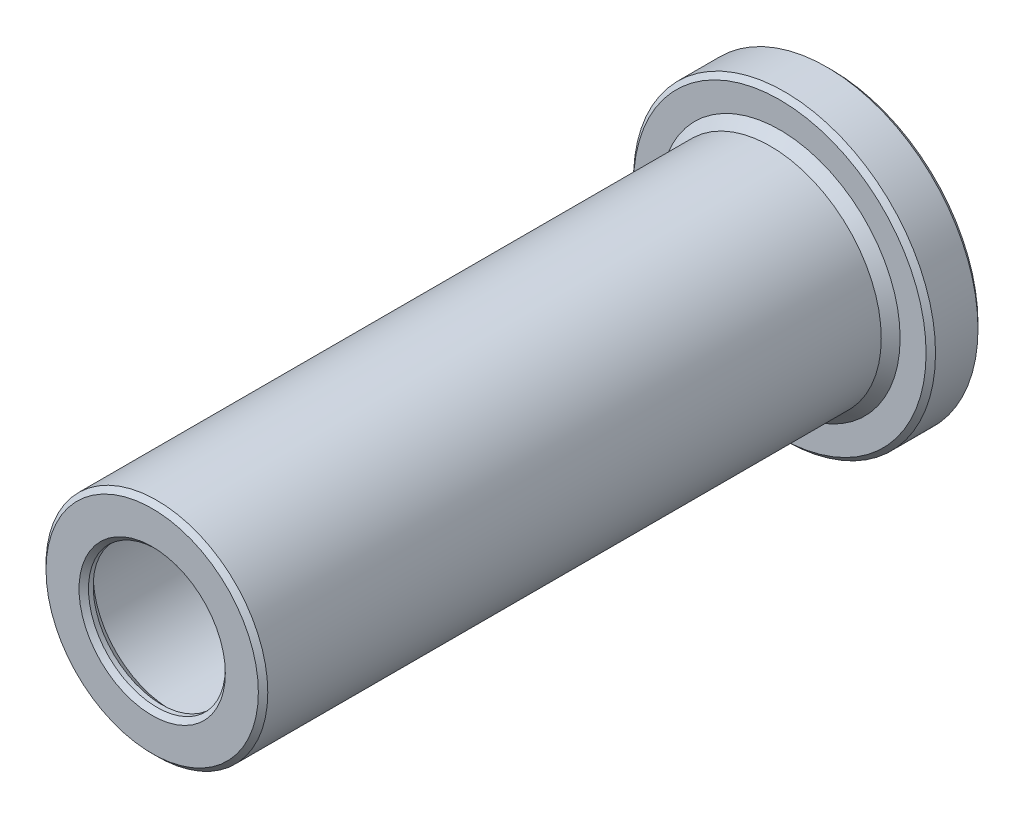
ISO-10303-21;
HEADER;
FILE_DESCRIPTION(('STEP AP214'),'2;1');
FILE_NAME('part.step','',(''),(''),'','','');
FILE_SCHEMA(('AUTOMOTIVE_DESIGN { 1 0 10303 214 1 1 1 1 }'));
ENDSEC;
DATA;
#1=APPLICATION_CONTEXT('core data for automotive mechanical design processes');
#2=APPLICATION_PROTOCOL_DEFINITION('international standard','automotive_design',2000,#1);
#3=PRODUCT_CONTEXT('',#1,'mechanical');
#4=PRODUCT('Part','Part','',(#3));
#5=PRODUCT_RELATED_PRODUCT_CATEGORY('part','',(#4));
#6=PRODUCT_DEFINITION_FORMATION('','',#4);
#7=PRODUCT_DEFINITION_CONTEXT('part definition',#1,'design');
#8=PRODUCT_DEFINITION('design','',#6,#7);
#9=PRODUCT_DEFINITION_SHAPE('','',#8);
#10=(LENGTH_UNIT() NAMED_UNIT(*) SI_UNIT(.MILLI.,.METRE.));
#11=(NAMED_UNIT(*) PLANE_ANGLE_UNIT() SI_UNIT($,.RADIAN.));
#12=(NAMED_UNIT(*) SI_UNIT($,.STERADIAN.) SOLID_ANGLE_UNIT());
#13=UNCERTAINTY_MEASURE_WITH_UNIT(LENGTH_MEASURE(1.E-05),#10,'distance_accuracy_value','');
#14=(GEOMETRIC_REPRESENTATION_CONTEXT(3) GLOBAL_UNCERTAINTY_ASSIGNED_CONTEXT((#13)) GLOBAL_UNIT_ASSIGNED_CONTEXT((#10,
#11,#12)) REPRESENTATION_CONTEXT('',''));
#15=CARTESIAN_POINT('',(0.,0.,0.));
#16=DIRECTION('',(0.,0.,1.));
#17=DIRECTION('',(1.,0.,0.));
#18=AXIS2_PLACEMENT_3D('',#15,#16,#17);
#19=CARTESIAN_POINT('',(0.,0.,0.));
#20=DIRECTION('',(0.,0.,1.));
#21=DIRECTION('',(1.,0.,0.));
#22=AXIS2_PLACEMENT_3D('',#19,#20,#21);
#23=PLANE('',#22);
#24=CARTESIAN_POINT('',(0.,0.,0.));
#25=DIRECTION('',(0.,0.,1.));
#26=DIRECTION('',(1.,0.,0.));
#27=AXIS2_PLACEMENT_3D('',#24,#25,#26);
#28=CIRCLE('',#27,12.75);
#29=CARTESIAN_POINT('',(-12.75,0.,0.));
#30=VERTEX_POINT('',#29);
#31=EDGE_CURVE('E136',#30,#30,#28,.T.);
#32=ORIENTED_EDGE('',*,*,#31,.T.);
#33=EDGE_LOOP('',(#32));
#34=FACE_BOUND('',#33,.T.);
#35=CARTESIAN_POINT('',(0.,0.,0.));
#36=DIRECTION('',(0.,0.,1.));
#37=DIRECTION('',(1.,0.,0.));
#38=AXIS2_PLACEMENT_3D('',#35,#36,#37);
#39=CIRCLE('',#38,15.5);
#40=CARTESIAN_POINT('',(15.5,0.,0.));
#41=VERTEX_POINT('',#40);
#42=EDGE_CURVE('E140',#41,#41,#39,.F.);
#43=ORIENTED_EDGE('',*,*,#42,.T.);
#44=EDGE_LOOP('',(#43));
#45=FACE_BOUND('',#44,.T.);
#46=ADVANCED_FACE('F79',(#34,#45),#23,.F.);
#47=CARTESIAN_POINT('',(0.,0.,70.));
#48=DIRECTION('',(0.,0.,-1.));
#49=DIRECTION('',(-1.,0.,0.));
#50=AXIS2_PLACEMENT_3D('',#47,#48,#49);
#51=CYLINDRICAL_SURFACE('',#50,11.75);
#52=CARTESIAN_POINT('',(0.,0.,71.5));
#53=DIRECTION('',(0.,0.,1.));
#54=DIRECTION('',(1.,0.,0.));
#55=AXIS2_PLACEMENT_3D('',#52,#53,#54);
#56=CIRCLE('',#55,11.75);
#57=CARTESIAN_POINT('',(11.75,0.,71.5));
#58=VERTEX_POINT('',#57);
#59=EDGE_CURVE('E116',#58,#58,#56,.F.);
#60=ORIENTED_EDGE('',*,*,#59,.T.);
#61=EDGE_LOOP('',(#60));
#62=FACE_BOUND('',#61,.T.);
#63=CARTESIAN_POINT('',(0.,0.,6.50000000000001));
#64=DIRECTION('',(0.,0.,1.));
#65=DIRECTION('',(1.,0.,0.));
#66=AXIS2_PLACEMENT_3D('',#63,#64,#65);
#67=CIRCLE('',#66,11.75);
#68=CARTESIAN_POINT('',(11.75,0.,6.50000000000001));
#69=VERTEX_POINT('',#68);
#70=EDGE_CURVE('E120',#69,#69,#67,.T.);
#71=ORIENTED_EDGE('',*,*,#70,.T.);
#72=EDGE_LOOP('',(#71));
#73=FACE_BOUND('',#72,.T.);
#74=ADVANCED_FACE('F168',(#62,#73),#51,.T.);
#75=CARTESIAN_POINT('',(0.,0.,70.));
#76=DIRECTION('',(0.,0.,-1.));
#77=DIRECTION('',(-1.,0.,0.));
#78=AXIS2_PLACEMENT_3D('',#75,#76,#77);
#79=CYLINDRICAL_SURFACE('',#78,9.25);
#80=CARTESIAN_POINT('',(0.,0.,3.5));
#81=DIRECTION('',(0.,0.,1.));
#82=DIRECTION('',(1.,0.,0.));
#83=AXIS2_PLACEMENT_3D('',#80,#81,#82);
#84=CIRCLE('',#83,9.25);
#85=CARTESIAN_POINT('',(-9.25,0.,3.5));
#86=VERTEX_POINT('',#85);
#87=EDGE_CURVE('E132',#86,#86,#84,.F.);
#88=ORIENTED_EDGE('',*,*,#87,.T.);
#89=EDGE_LOOP('',(#88));
#90=FACE_BOUND('',#89,.T.);
#91=CARTESIAN_POINT('',(0.,0.,70.));
#92=DIRECTION('',(0.,0.,1.));
#93=DIRECTION('',(1.,0.,0.));
#94=AXIS2_PLACEMENT_3D('',#91,#92,#93);
#95=CIRCLE('',#94,9.25);
#96=CARTESIAN_POINT('',(9.25,0.,70.));
#97=VERTEX_POINT('',#96);
#98=EDGE_CURVE('E144',#97,#97,#95,.T.);
#99=ORIENTED_EDGE('',*,*,#98,.T.);
#100=EDGE_LOOP('',(#99));
#101=FACE_BOUND('',#100,.T.);
#102=ADVANCED_FACE('F149',(#90,#101),#79,.F.);
#103=CARTESIAN_POINT('',(0.,0.,5.5));
#104=DIRECTION('',(0.,0.,1.));
#105=DIRECTION('',(1.,0.,0.));
#106=AXIS2_PLACEMENT_3D('',#103,#104,#105);
#107=PLANE('',#106);
#108=CARTESIAN_POINT('',(0.,0.,5.5));
#109=DIRECTION('',(0.,0.,1.));
#110=DIRECTION('',(1.,0.,0.));
#111=AXIS2_PLACEMENT_3D('',#108,#109,#110);
#112=CIRCLE('',#111,15.5);
#113=CARTESIAN_POINT('',(15.5,0.,5.5));
#114=VERTEX_POINT('',#113);
#115=EDGE_CURVE('E88',#114,#114,#112,.T.);
#116=ORIENTED_EDGE('',*,*,#115,.T.);
#117=EDGE_LOOP('',(#116));
#118=FACE_BOUND('',#117,.T.);
#119=CARTESIAN_POINT('',(0.,0.,5.5));
#120=DIRECTION('',(0.,0.,1.));
#121=DIRECTION('',(1.,0.,0.));
#122=AXIS2_PLACEMENT_3D('',#119,#120,#121);
#123=CIRCLE('',#122,12.75);
#124=CARTESIAN_POINT('',(12.75,0.,5.5));
#125=VERTEX_POINT('',#124);
#126=EDGE_CURVE('E93',#125,#125,#123,.F.);
#127=ORIENTED_EDGE('',*,*,#126,.T.);
#128=EDGE_LOOP('',(#127));
#129=FACE_BOUND('',#128,.T.);
#130=ADVANCED_FACE('F163',(#118,#129),#107,.T.);
#131=CARTESIAN_POINT('',(0.,0.,5.5));
#132=DIRECTION('',(0.,0.,-1.));
#133=DIRECTION('',(-1.,0.,0.));
#134=AXIS2_PLACEMENT_3D('',#131,#132,#133);
#135=CYLINDRICAL_SURFACE('',#134,16.);
#136=CARTESIAN_POINT('',(0.,0.,0.5));
#137=DIRECTION('',(0.,0.,1.));
#138=DIRECTION('',(1.,0.,0.));
#139=AXIS2_PLACEMENT_3D('',#136,#137,#138);
#140=CIRCLE('',#139,16.);
#141=CARTESIAN_POINT('',(16.,0.,0.5));
#142=VERTEX_POINT('',#141);
#143=EDGE_CURVE('E98',#142,#142,#140,.T.);
#144=ORIENTED_EDGE('',*,*,#143,.T.);
#145=EDGE_LOOP('',(#144));
#146=FACE_BOUND('',#145,.T.);
#147=CARTESIAN_POINT('',(0.,0.,5.));
#148=DIRECTION('',(0.,0.,1.));
#149=DIRECTION('',(1.,0.,0.));
#150=AXIS2_PLACEMENT_3D('',#147,#148,#149);
#151=CIRCLE('',#150,16.);
#152=CARTESIAN_POINT('',(16.,0.,5.));
#153=VERTEX_POINT('',#152);
#154=EDGE_CURVE('E104',#153,#153,#151,.F.);
#155=ORIENTED_EDGE('',*,*,#154,.T.);
#156=EDGE_LOOP('',(#155));
#157=FACE_BOUND('',#156,.T.);
#158=ADVANCED_FACE('F154',(#146,#157),#135,.T.);
#159=CARTESIAN_POINT('',(0.,0.,70.));
#160=DIRECTION('',(0.,0.,1.));
#161=DIRECTION('',(1.,0.,0.));
#162=AXIS2_PLACEMENT_3D('',#159,#160,#161);
#163=PLANE('',#162);
#164=CARTESIAN_POINT('',(0.,0.,70.));
#165=DIRECTION('',(0.,0.,1.));
#166=DIRECTION('',(1.,0.,0.));
#167=AXIS2_PLACEMENT_3D('',#164,#165,#166);
#168=CIRCLE('',#167,8.25);
#169=CARTESIAN_POINT('',(8.25,0.,70.));
#170=VERTEX_POINT('',#169);
#171=EDGE_CURVE('E12',#170,#170,#168,.T.);
#172=ORIENTED_EDGE('',*,*,#171,.T.);
#173=EDGE_LOOP('',(#172));
#174=FACE_BOUND('',#173,.T.);
#175=ORIENTED_EDGE('',*,*,#98,.F.);
#176=EDGE_LOOP('',(#175));
#177=FACE_BOUND('',#176,.T.);
#178=ADVANCED_FACE('F151',(#174,#177),#163,.F.);
#179=CARTESIAN_POINT('',(0.,0.,72.));
#180=DIRECTION('',(0.,0.,1.));
#181=DIRECTION('',(1.,0.,0.));
#182=AXIS2_PLACEMENT_3D('',#179,#180,#181);
#183=PLANE('',#182);
#184=CARTESIAN_POINT('',(0.,0.,72.));
#185=DIRECTION('',(0.,0.,1.));
#186=DIRECTION('',(1.,0.,0.));
#187=AXIS2_PLACEMENT_3D('',#184,#185,#186);
#188=CIRCLE('',#187,11.25);
#189=CARTESIAN_POINT('',(11.25,0.,72.));
#190=VERTEX_POINT('',#189);
#191=EDGE_CURVE('E124',#190,#190,#188,.T.);
#192=ORIENTED_EDGE('',*,*,#191,.T.);
#193=EDGE_LOOP('',(#192));
#194=FACE_BOUND('',#193,.T.);
#195=CARTESIAN_POINT('',(0.,0.,72.));
#196=DIRECTION('',(0.,0.,1.));
#197=DIRECTION('',(1.,0.,0.));
#198=AXIS2_PLACEMENT_3D('',#195,#196,#197);
#199=CIRCLE('',#198,7.75);
#200=CARTESIAN_POINT('',(7.75,0.,72.));
#201=VERTEX_POINT('',#200);
#202=EDGE_CURVE('E128',#201,#201,#199,.F.);
#203=ORIENTED_EDGE('',*,*,#202,.T.);
#204=EDGE_LOOP('',(#203));
#205=FACE_BOUND('',#204,.T.);
#206=ADVANCED_FACE('F153',(#194,#205),#183,.T.);
#207=CARTESIAN_POINT('',(0.,0.,72.));
#208=DIRECTION('',(0.,0.,-1.));
#209=DIRECTION('',(-1.,0.,0.));
#210=AXIS2_PLACEMENT_3D('',#207,#208,#209);
#211=CYLINDRICAL_SURFACE('',#210,7.25);
#212=CARTESIAN_POINT('',(0.,0.,71.5));
#213=DIRECTION('',(0.,0.,1.));
#214=DIRECTION('',(1.,0.,0.));
#215=AXIS2_PLACEMENT_3D('',#212,#213,#214);
#216=CIRCLE('',#215,7.25);
#217=CARTESIAN_POINT('',(7.25,0.,71.5));
#218=VERTEX_POINT('',#217);
#219=EDGE_CURVE('E108',#218,#218,#216,.T.);
#220=ORIENTED_EDGE('',*,*,#219,.T.);
#221=EDGE_LOOP('',(#220));
#222=FACE_BOUND('',#221,.T.);
#223=CARTESIAN_POINT('',(0.,0.,71.));
#224=DIRECTION('',(0.,0.,1.));
#225=DIRECTION('',(1.,0.,0.));
#226=AXIS2_PLACEMENT_3D('',#223,#224,#225);
#227=CIRCLE('',#226,7.25);
#228=CARTESIAN_POINT('',(7.25,0.,71.));
#229=VERTEX_POINT('',#228);
#230=EDGE_CURVE('E112',#229,#229,#227,.F.);
#231=ORIENTED_EDGE('',*,*,#230,.T.);
#232=EDGE_LOOP('',(#231));
#233=FACE_BOUND('',#232,.T.);
#234=ADVANCED_FACE('F160',(#222,#233),#211,.F.);
#235=CARTESIAN_POINT('',(0.,0.,0.));
#236=DIRECTION('',(0.,0.,-1.));
#237=DIRECTION('',(-1.,0.,0.));
#238=AXIS2_PLACEMENT_3D('',#235,#236,#237);
#239=CONICAL_SURFACE('',#238,12.75,0.785398163397448);
#240=CARTESIAN_POINT('',(-9.25,0.,3.5));
#241=CARTESIAN_POINT('',(-9.28645833333333,0.,3.46354166666667));
#242=CARTESIAN_POINT('',(-9.32291666666667,0.,3.42708333333334));
#243=CARTESIAN_POINT('',(-9.39583333333333,0.,3.35416666666667));
#244=CARTESIAN_POINT('',(-9.43229166666667,0.,3.31770833333334));
#245=CARTESIAN_POINT('',(-9.50520833333333,0.,3.24479166666667));
#246=CARTESIAN_POINT('',(-9.54166666666667,0.,3.20833333333334));
#247=CARTESIAN_POINT('',(-9.61458333333333,0.,3.13541666666667));
#248=CARTESIAN_POINT('',(-9.65104166666667,0.,3.09895833333334));
#249=CARTESIAN_POINT('',(-9.72395833333333,0.,3.02604166666667));
#250=CARTESIAN_POINT('',(-9.76041666666667,0.,2.98958333333334));
#251=CARTESIAN_POINT('',(-9.83333333333333,0.,2.91666666666667));
#252=CARTESIAN_POINT('',(-9.86979166666667,0.,2.88020833333334));
#253=CARTESIAN_POINT('',(-9.94270833333333,0.,2.80729166666667));
#254=CARTESIAN_POINT('',(-9.97916666666667,0.,2.77083333333334));
#255=CARTESIAN_POINT('',(-10.0520833333333,0.,2.69791666666667));
#256=CARTESIAN_POINT('',(-10.0885416666667,0.,2.66145833333334));
#257=CARTESIAN_POINT('',(-10.1614583333333,0.,2.58854166666667));
#258=CARTESIAN_POINT('',(-10.1979166666667,0.,2.55208333333333));
#259=CARTESIAN_POINT('',(-10.2708333333333,0.,2.47916666666667));
#260=CARTESIAN_POINT('',(-10.3072916666667,0.,2.44270833333333));
#261=CARTESIAN_POINT('',(-10.3802083333333,0.,2.36979166666667));
#262=CARTESIAN_POINT('',(-10.4166666666667,0.,2.33333333333333));
#263=CARTESIAN_POINT('',(-10.4895833333333,0.,2.26041666666667));
#264=CARTESIAN_POINT('',(-10.5260416666667,0.,2.22395833333333));
#265=CARTESIAN_POINT('',(-10.5989583333333,0.,2.15104166666667));
#266=CARTESIAN_POINT('',(-10.6354166666667,0.,2.11458333333333));
#267=CARTESIAN_POINT('',(-10.7083333333333,0.,2.04166666666667));
#268=CARTESIAN_POINT('',(-10.7447916666667,0.,2.00520833333333));
#269=CARTESIAN_POINT('',(-10.8177083333333,0.,1.93229166666667));
#270=CARTESIAN_POINT('',(-10.8541666666667,0.,1.89583333333333));
#271=CARTESIAN_POINT('',(-10.9270833333333,0.,1.82291666666667));
#272=CARTESIAN_POINT('',(-10.9635416666667,0.,1.78645833333333));
#273=CARTESIAN_POINT('',(-11.0364583333333,0.,1.71354166666667));
#274=CARTESIAN_POINT('',(-11.0729166666667,0.,1.67708333333333));
#275=CARTESIAN_POINT('',(-11.1458333333333,0.,1.60416666666667));
#276=CARTESIAN_POINT('',(-11.1822916666667,0.,1.56770833333333));
#277=CARTESIAN_POINT('',(-11.2552083333333,0.,1.49479166666667));
#278=CARTESIAN_POINT('',(-11.2916666666667,0.,1.45833333333333));
#279=CARTESIAN_POINT('',(-11.3645833333333,0.,1.38541666666667));
#280=CARTESIAN_POINT('',(-11.4010416666667,0.,1.34895833333333));
#281=CARTESIAN_POINT('',(-11.4739583333333,0.,1.27604166666667));
#282=CARTESIAN_POINT('',(-11.5104166666667,0.,1.23958333333333));
#283=CARTESIAN_POINT('',(-11.5833333333333,0.,1.16666666666667));
#284=CARTESIAN_POINT('',(-11.6197916666667,0.,1.13020833333333));
#285=CARTESIAN_POINT('',(-11.6927083333333,0.,1.05729166666667));
#286=CARTESIAN_POINT('',(-11.7291666666667,0.,1.02083333333333));
#287=CARTESIAN_POINT('',(-11.8020833333333,0.,0.947916666666667));
#288=CARTESIAN_POINT('',(-11.8385416666667,0.,0.911458333333334));
#289=CARTESIAN_POINT('',(-11.9114583333333,0.,0.838541666666667));
#290=CARTESIAN_POINT('',(-11.9479166666667,0.,0.802083333333334));
#291=CARTESIAN_POINT('',(-12.0208333333333,0.,0.729166666666667));
#292=CARTESIAN_POINT('',(-12.0572916666667,0.,0.692708333333334));
#293=CARTESIAN_POINT('',(-12.1302083333333,0.,0.619791666666667));
#294=CARTESIAN_POINT('',(-12.1666666666667,0.,0.583333333333334));
#295=CARTESIAN_POINT('',(-12.2395833333333,0.,0.510416666666667));
#296=CARTESIAN_POINT('',(-12.2760416666667,0.,0.473958333333334));
#297=CARTESIAN_POINT('',(-12.3489583333333,0.,0.401041666666667));
#298=CARTESIAN_POINT('',(-12.3854166666667,0.,0.364583333333334));
#299=CARTESIAN_POINT('',(-12.4583333333333,0.,0.291666666666667));
#300=CARTESIAN_POINT('',(-12.4947916666667,0.,0.255208333333334));
#301=CARTESIAN_POINT('',(-12.5677083333333,0.,0.182291666666667));
#302=CARTESIAN_POINT('',(-12.6041666666667,0.,0.145833333333333));
#303=CARTESIAN_POINT('',(-12.6770833333333,0.,0.0729166666666667));
#304=CARTESIAN_POINT('',(-12.7135416666667,0.,0.0364583333333333));
#305=CARTESIAN_POINT('',(-12.75,0.,0.));
#306=B_SPLINE_CURVE_WITH_KNOTS('',3,(#240,#241,#242,#243,#244,#245,#246,#247,#248,#249,#250,
#251,#252,#253,#254,#255,#256,#257,#258,#259,#260,#261,#262,#263,#264,#265,#266,#267,#268,#269,
#270,#271,#272,#273,#274,#275,#276,#277,#278,#279,#280,#281,#282,#283,#284,#285,#286,#287,#288,
#289,#290,#291,#292,#293,#294,#295,#296,#297,#298,#299,#300,#301,#302,#303,#304,#305),
.UNSPECIFIED.,.F.,.F.,(4,2,2,2,2,2,2,2,2,2,2,2,2,2,2,2,2,2,2,2,2,2,2,2,2,2,2,2,2,2,2,2,4),(0.,
0.154679608384557,0.309359216769115,0.464038825153672,0.618718433538228,0.773398041922787,
0.928077650307343,1.0827572586919,1.23743686707646,1.39211647546102,1.54679608384557,
1.70147569223013,1.85615530061469,2.01083490899925,2.1655145173838,2.32019412576836,
2.47487373415292,2.62955334253748,2.78423295092203,2.93891255930659,3.09359216769115,
3.24827177607571,3.40295138446026,3.55763099284482,3.71231060122938,3.86699020961393,
4.02166981799849,4.17634942638305,4.33102903476761,4.48570864315216,4.64038825153672,
4.79506785992128,4.94974746830584),.UNSPECIFIED.);
#307=EDGE_CURVE('BSEAM180',#86,#30,#306,.T.);
#308=ORIENTED_EDGE('',*,*,#87,.F.);
#309=ORIENTED_EDGE('',*,*,#31,.F.);
#310=ORIENTED_EDGE('',*,*,#307,.T.);
#311=ORIENTED_EDGE('',*,*,#307,.F.);
#312=EDGE_LOOP('',(#308,#310,#309,#311));
#313=FACE_BOUND('',#312,.T.);
#314=ADVANCED_FACE('F180',(#313),#239,.F.);
#315=CARTESIAN_POINT('',(0.,0.,72.));
#316=DIRECTION('',(0.,0.,-1.));
#317=DIRECTION('',(-1.,0.,0.));
#318=AXIS2_PLACEMENT_3D('',#315,#316,#317);
#319=CONICAL_SURFACE('',#318,11.25,0.785398163397448);
#320=ORIENTED_EDGE('',*,*,#59,.F.);
#321=EDGE_LOOP('',(#320));
#322=FACE_BOUND('',#321,.T.);
#323=ORIENTED_EDGE('',*,*,#191,.F.);
#324=EDGE_LOOP('',(#323));
#325=FACE_BOUND('',#324,.T.);
#326=ADVANCED_FACE('F186',(#322,#325),#319,.T.);
#327=CARTESIAN_POINT('',(0.,0.,71.5));
#328=DIRECTION('',(0.,0.,1.));
#329=DIRECTION('',(1.,0.,0.));
#330=AXIS2_PLACEMENT_3D('',#327,#328,#329);
#331=CONICAL_SURFACE('',#330,7.25,0.785398163397447);
#332=ORIENTED_EDGE('',*,*,#202,.F.);
#333=EDGE_LOOP('',(#332));
#334=FACE_BOUND('',#333,.T.);
#335=ORIENTED_EDGE('',*,*,#219,.F.);
#336=EDGE_LOOP('',(#335));
#337=FACE_BOUND('',#336,.T.);
#338=ADVANCED_FACE('F193',(#334,#337),#331,.F.);
#339=CARTESIAN_POINT('',(0.,0.,0.5));
#340=DIRECTION('',(0.,0.,1.));
#341=DIRECTION('',(1.,0.,0.));
#342=AXIS2_PLACEMENT_3D('',#339,#340,#341);
#343=CONICAL_SURFACE('',#342,16.,0.785398163397448);
#344=ORIENTED_EDGE('',*,*,#42,.F.);
#345=EDGE_LOOP('',(#344));
#346=FACE_BOUND('',#345,.T.);
#347=ORIENTED_EDGE('',*,*,#143,.F.);
#348=EDGE_LOOP('',(#347));
#349=FACE_BOUND('',#348,.T.);
#350=ADVANCED_FACE('F200',(#346,#349),#343,.T.);
#351=CARTESIAN_POINT('',(0.,0.,5.5));
#352=DIRECTION('',(0.,0.,-1.));
#353=DIRECTION('',(-1.,0.,0.));
#354=AXIS2_PLACEMENT_3D('',#351,#352,#353);
#355=CONICAL_SURFACE('',#354,15.5,0.785398163397448);
#356=ORIENTED_EDGE('',*,*,#154,.F.);
#357=EDGE_LOOP('',(#356));
#358=FACE_BOUND('',#357,.T.);
#359=ORIENTED_EDGE('',*,*,#115,.F.);
#360=EDGE_LOOP('',(#359));
#361=FACE_BOUND('',#360,.T.);
#362=ADVANCED_FACE('F207',(#358,#361),#355,.T.);
#363=CARTESIAN_POINT('',(0.,0.,6.50000000000001));
#364=DIRECTION('',(0.,0.,-1.));
#365=DIRECTION('',(-1.,0.,0.));
#366=AXIS2_PLACEMENT_3D('',#363,#364,#365);
#367=CONICAL_SURFACE('',#366,11.75,0.785398163397448);
#368=ORIENTED_EDGE('',*,*,#126,.F.);
#369=EDGE_LOOP('',(#368));
#370=FACE_BOUND('',#369,.T.);
#371=ORIENTED_EDGE('',*,*,#70,.F.);
#372=EDGE_LOOP('',(#371));
#373=FACE_BOUND('',#372,.T.);
#374=ADVANCED_FACE('F213',(#370,#373),#367,.T.);
#375=CARTESIAN_POINT('',(0.,0.,70.));
#376=DIRECTION('',(0.,0.,-1.));
#377=DIRECTION('',(-1.,0.,0.));
#378=AXIS2_PLACEMENT_3D('',#375,#376,#377);
#379=CONICAL_SURFACE('',#378,8.25,0.785398163397448);
#380=ORIENTED_EDGE('',*,*,#230,.F.);
#381=EDGE_LOOP('',(#380));
#382=FACE_BOUND('',#381,.T.);
#383=ORIENTED_EDGE('',*,*,#171,.F.);
#384=EDGE_LOOP('',(#383));
#385=FACE_BOUND('',#384,.T.);
#386=ADVANCED_FACE('F82',(#382,#385),#379,.F.);
#387=CLOSED_SHELL('',(#46,#74,#102,#130,#158,#178,#206,#234,#314,#326,#338,#350,#362,#374,#386));
#388=MANIFOLD_SOLID_BREP('B2',#387);
#389=ADVANCED_BREP_SHAPE_REPRESENTATION('',(#18,#388),#14);
#390=SHAPE_DEFINITION_REPRESENTATION(#9,#389);
ENDSEC;
END-ISO-10303-21;
